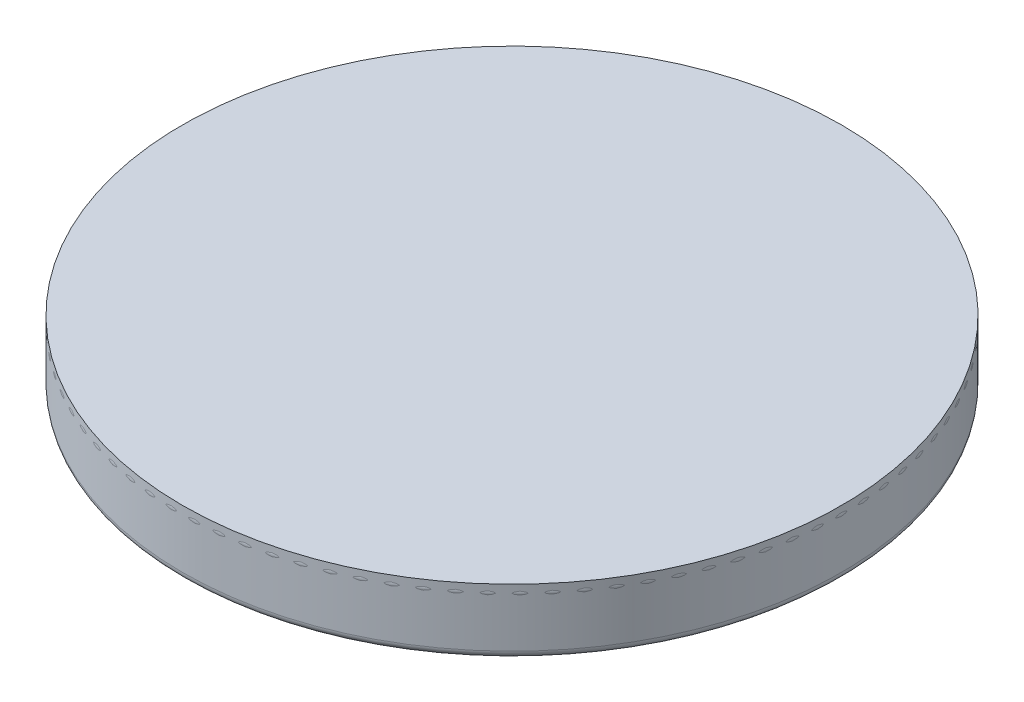
ISO-10303-21;
HEADER;
FILE_DESCRIPTION(('STEP AP214'),'2;1');
FILE_NAME('part.step','',(''),(''),'','','');
FILE_SCHEMA(('AUTOMOTIVE_DESIGN { 1 0 10303 214 1 1 1 1 }'));
ENDSEC;
DATA;
#1=APPLICATION_CONTEXT('core data for automotive mechanical design processes');
#2=APPLICATION_PROTOCOL_DEFINITION('international standard','automotive_design',2000,#1);
#3=PRODUCT_CONTEXT('',#1,'mechanical');
#4=PRODUCT('Part','Part','',(#3));
#5=PRODUCT_RELATED_PRODUCT_CATEGORY('part','',(#4));
#6=PRODUCT_DEFINITION_FORMATION('','',#4);
#7=PRODUCT_DEFINITION_CONTEXT('part definition',#1,'design');
#8=PRODUCT_DEFINITION('design','',#6,#7);
#9=PRODUCT_DEFINITION_SHAPE('','',#8);
#10=(LENGTH_UNIT() NAMED_UNIT(*) SI_UNIT(.MILLI.,.METRE.));
#11=(NAMED_UNIT(*) PLANE_ANGLE_UNIT() SI_UNIT($,.RADIAN.));
#12=(NAMED_UNIT(*) SI_UNIT($,.STERADIAN.) SOLID_ANGLE_UNIT());
#13=UNCERTAINTY_MEASURE_WITH_UNIT(LENGTH_MEASURE(1.E-05),#10,'distance_accuracy_value','');
#14=(GEOMETRIC_REPRESENTATION_CONTEXT(3) GLOBAL_UNCERTAINTY_ASSIGNED_CONTEXT((#13)) GLOBAL_UNIT_ASSIGNED_CONTEXT((#10,
#11,#12)) REPRESENTATION_CONTEXT('',''));
#15=CARTESIAN_POINT('',(0.,0.,0.));
#16=DIRECTION('',(0.,0.,1.));
#17=DIRECTION('',(1.,0.,0.));
#18=AXIS2_PLACEMENT_3D('',#15,#16,#17);
#19=CARTESIAN_POINT('',(0.,1.25,0.));
#20=DIRECTION('',(0.,-1.,0.));
#21=DIRECTION('',(0.,0.,-1.));
#22=AXIS2_PLACEMENT_3D('',#19,#20,#21);
#23=PLANE('',#22);
#24=CARTESIAN_POINT('',(0.,1.25,0.));
#25=DIRECTION('',(0.,-1.,0.));
#26=DIRECTION('',(0.,0.,-1.));
#27=AXIS2_PLACEMENT_3D('',#24,#25,#26);
#28=CIRCLE('',#27,12.5);
#29=CARTESIAN_POINT('',(0.,1.25,-12.5));
#30=VERTEX_POINT('',#29);
#31=EDGE_CURVE('P0_E23',#30,#30,#28,.T.);
#32=ORIENTED_EDGE('',*,*,#31,.F.);
#33=EDGE_LOOP('',(#32));
#34=FACE_BOUND('',#33,.T.);
#35=ADVANCED_FACE('P0_F15',(#34),#23,.F.);
#36=CARTESIAN_POINT('',(0.,-1.25,0.));
#37=DIRECTION('',(0.,-1.,0.));
#38=DIRECTION('',(0.,0.,-1.));
#39=AXIS2_PLACEMENT_3D('',#36,#37,#38);
#40=PLANE('',#39);
#41=CARTESIAN_POINT('',(0.,-1.25,0.));
#42=DIRECTION('',(0.,-1.,0.));
#43=DIRECTION('',(0.,0.,-1.));
#44=AXIS2_PLACEMENT_3D('',#41,#42,#43);
#45=CIRCLE('',#44,12.2);
#46=CARTESIAN_POINT('',(0.,-1.25,-12.2));
#47=VERTEX_POINT('',#46);
#48=EDGE_CURVE('P0_E18',#47,#47,#45,.F.);
#49=ORIENTED_EDGE('',*,*,#48,.F.);
#50=EDGE_LOOP('',(#49));
#51=FACE_BOUND('',#50,.T.);
#52=ADVANCED_FACE('P0_F44',(#51),#40,.T.);
#53=CARTESIAN_POINT('',(0.,-0.95,0.));
#54=DIRECTION('',(0.,-1.,0.));
#55=DIRECTION('',(1.,0.,0.));
#56=AXIS2_PLACEMENT_3D('',#53,#54,#55);
#57=TOROIDAL_SURFACE('',#56,12.2,0.3);
#58=CARTESIAN_POINT('',(0.,-0.95,0.));
#59=DIRECTION('',(0.,1.,0.));
#60=DIRECTION('',(0.,0.,1.));
#61=AXIS2_PLACEMENT_3D('',#58,#59,#60);
#62=CIRCLE('',#61,12.5);
#63=CARTESIAN_POINT('',(0.,-0.95,12.5));
#64=VERTEX_POINT('',#63);
#65=EDGE_CURVE('P0_E10',#64,#64,#62,.T.);
#66=ORIENTED_EDGE('',*,*,#65,.F.);
#67=EDGE_LOOP('',(#66));
#68=FACE_BOUND('',#67,.T.);
#69=ORIENTED_EDGE('',*,*,#48,.T.);
#70=EDGE_LOOP('',(#69));
#71=FACE_BOUND('',#70,.T.);
#72=ADVANCED_FACE('P0_F43',(#68,#71),#57,.T.);
#73=CARTESIAN_POINT('',(0.,1.25,0.));
#74=DIRECTION('',(0.,1.,0.));
#75=DIRECTION('',(1.,0.,0.));
#76=AXIS2_PLACEMENT_3D('',#73,#74,#75);
#77=CYLINDRICAL_SURFACE('',#76,12.5);
#78=ORIENTED_EDGE('',*,*,#65,.T.);
#79=EDGE_LOOP('',(#78));
#80=FACE_BOUND('',#79,.T.);
#81=ORIENTED_EDGE('',*,*,#31,.T.);
#82=EDGE_LOOP('',(#81));
#83=FACE_BOUND('',#82,.T.);
#84=ADVANCED_FACE('P0_F55',(#80,#83),#77,.T.);
#85=CLOSED_SHELL('',(#35,#52,#72,#84));
#86=MANIFOLD_SOLID_BREP('P0_B1',#85);
#87=CARTESIAN_POINT('',(0.,0.95,0.));
#88=DIRECTION('',(0.,1.,0.));
#89=DIRECTION('',(1.,0.,0.));
#90=AXIS2_PLACEMENT_3D('',#87,#88,#89);
#91=TOROIDAL_SURFACE('',#90,12.2,0.3);
#92=CARTESIAN_POINT('',(12.5,0.95,0.));
#93=VERTEX_POINT('',#92);
#94=VERTEX_LOOP('',#93);
#95=FACE_BOUND('',#94,.T.);
#96=ADVANCED_FACE('P1_F13',(#95),#91,.T.);
#97=CLOSED_SHELL('',(#96));
#98=MANIFOLD_SOLID_BREP('P1_B1',#97);
#99=ADVANCED_BREP_SHAPE_REPRESENTATION('',(#18,#86,#98),#14);
#100=SHAPE_DEFINITION_REPRESENTATION(#9,#99);
ENDSEC;
END-ISO-10303-21;
